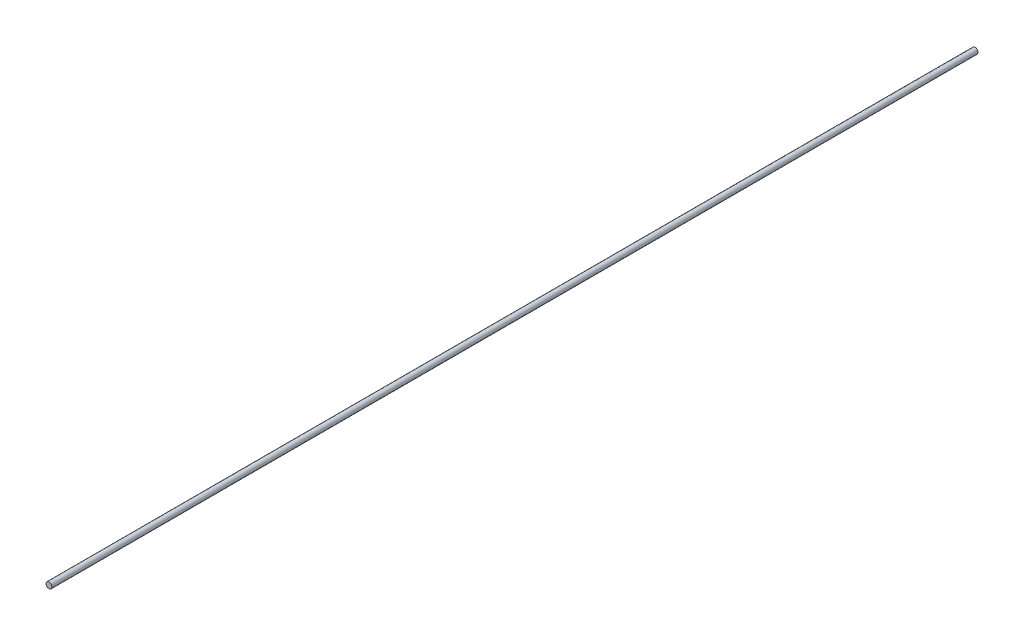
ISO-10303-21;
HEADER;
FILE_DESCRIPTION(('STEP AP214'),'2;1');
FILE_NAME('part.step','',(''),(''),'','','');
FILE_SCHEMA(('AUTOMOTIVE_DESIGN { 1 0 10303 214 1 1 1 1 }'));
ENDSEC;
DATA;
#1=APPLICATION_CONTEXT('core data for automotive mechanical design processes');
#2=APPLICATION_PROTOCOL_DEFINITION('international standard','automotive_design',2000,#1);
#3=PRODUCT_CONTEXT('',#1,'mechanical');
#4=PRODUCT('Part','Part','',(#3));
#5=PRODUCT_RELATED_PRODUCT_CATEGORY('part','',(#4));
#6=PRODUCT_DEFINITION_FORMATION('','',#4);
#7=PRODUCT_DEFINITION_CONTEXT('part definition',#1,'design');
#8=PRODUCT_DEFINITION('design','',#6,#7);
#9=PRODUCT_DEFINITION_SHAPE('','',#8);
#10=(LENGTH_UNIT() NAMED_UNIT(*) SI_UNIT(.MILLI.,.METRE.));
#11=(NAMED_UNIT(*) PLANE_ANGLE_UNIT() SI_UNIT($,.RADIAN.));
#12=(NAMED_UNIT(*) SI_UNIT($,.STERADIAN.) SOLID_ANGLE_UNIT());
#13=UNCERTAINTY_MEASURE_WITH_UNIT(LENGTH_MEASURE(1.E-05),#10,'distance_accuracy_value','');
#14=(GEOMETRIC_REPRESENTATION_CONTEXT(3) GLOBAL_UNCERTAINTY_ASSIGNED_CONTEXT((#13)) GLOBAL_UNIT_ASSIGNED_CONTEXT((#10,
#11,#12)) REPRESENTATION_CONTEXT('',''));
#15=CARTESIAN_POINT('',(0.,0.,0.));
#16=DIRECTION('',(0.,0.,1.));
#17=DIRECTION('',(1.,0.,0.));
#18=AXIS2_PLACEMENT_3D('',#15,#16,#17);
#19=CARTESIAN_POINT('',(0.,0.,1500.));
#20=DIRECTION('',(0.,0.,-1.));
#21=DIRECTION('',(-1.,0.,0.));
#22=AXIS2_PLACEMENT_3D('',#19,#20,#21);
#23=CYLINDRICAL_SURFACE('',#22,4.7625);
#24=CARTESIAN_POINT('',(0.,0.,1500.));
#25=DIRECTION('',(0.,0.,1.));
#26=DIRECTION('',(1.,0.,0.));
#27=AXIS2_PLACEMENT_3D('',#24,#25,#26);
#28=CIRCLE('',#27,4.7625);
#29=CARTESIAN_POINT('',(4.7625,0.,1500.));
#30=VERTEX_POINT('',#29);
#31=EDGE_CURVE('E10',#30,#30,#28,.T.);
#32=ORIENTED_EDGE('',*,*,#31,.F.);
#33=EDGE_LOOP('',(#32));
#34=FACE_BOUND('',#33,.T.);
#35=CARTESIAN_POINT('',(0.,0.,0.));
#36=DIRECTION('',(0.,0.,1.));
#37=DIRECTION('',(1.,0.,0.));
#38=AXIS2_PLACEMENT_3D('',#35,#36,#37);
#39=CIRCLE('',#38,4.7625);
#40=CARTESIAN_POINT('',(4.7625,0.,0.));
#41=VERTEX_POINT('',#40);
#42=EDGE_CURVE('E36',#41,#41,#39,.T.);
#43=ORIENTED_EDGE('',*,*,#42,.T.);
#44=EDGE_LOOP('',(#43));
#45=FACE_BOUND('',#44,.T.);
#46=ADVANCED_FACE('F33',(#34,#45),#23,.T.);
#47=CARTESIAN_POINT('',(0.,0.,1500.));
#48=DIRECTION('',(0.,0.,1.));
#49=DIRECTION('',(1.,0.,0.));
#50=AXIS2_PLACEMENT_3D('',#47,#48,#49);
#51=PLANE('',#50);
#52=ORIENTED_EDGE('',*,*,#31,.T.);
#53=EDGE_LOOP('',(#52));
#54=FACE_BOUND('',#53,.T.);
#55=ADVANCED_FACE('F48',(#54),#51,.T.);
#56=CARTESIAN_POINT('',(0.,0.,0.));
#57=DIRECTION('',(0.,0.,1.));
#58=DIRECTION('',(1.,0.,0.));
#59=AXIS2_PLACEMENT_3D('',#56,#57,#58);
#60=PLANE('',#59);
#61=ORIENTED_EDGE('',*,*,#42,.F.);
#62=EDGE_LOOP('',(#61));
#63=FACE_BOUND('',#62,.T.);
#64=ADVANCED_FACE('F46',(#63),#60,.F.);
#65=CLOSED_SHELL('',(#46,#55,#64));
#66=MANIFOLD_SOLID_BREP('B2',#65);
#67=ADVANCED_BREP_SHAPE_REPRESENTATION('',(#18,#66),#14);
#68=SHAPE_DEFINITION_REPRESENTATION(#9,#67);
ENDSEC;
END-ISO-10303-21;
